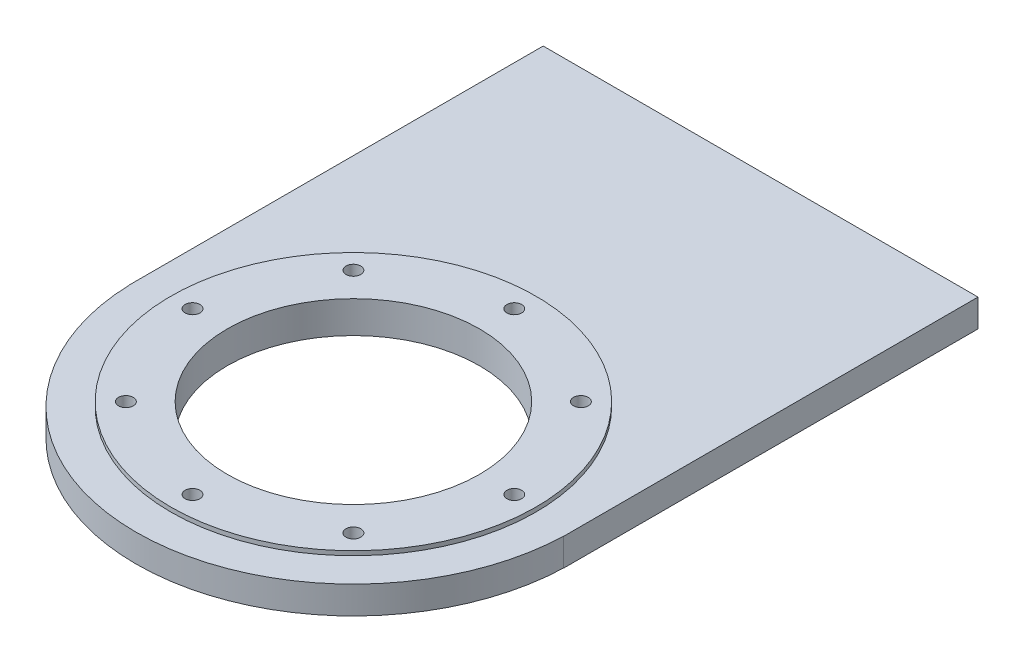
ISO-10303-21;
HEADER;
FILE_DESCRIPTION(('STEP AP214'),'2;1');
FILE_NAME('part.step','',(''),(''),'','','');
FILE_SCHEMA(('AUTOMOTIVE_DESIGN { 1 0 10303 214 1 1 1 1 }'));
ENDSEC;
DATA;
#1=APPLICATION_CONTEXT('core data for automotive mechanical design processes');
#2=APPLICATION_PROTOCOL_DEFINITION('international standard','automotive_design',2000,#1);
#3=PRODUCT_CONTEXT('',#1,'mechanical');
#4=PRODUCT('Part','Part','',(#3));
#5=PRODUCT_RELATED_PRODUCT_CATEGORY('part','',(#4));
#6=PRODUCT_DEFINITION_FORMATION('','',#4);
#7=PRODUCT_DEFINITION_CONTEXT('part definition',#1,'design');
#8=PRODUCT_DEFINITION('design','',#6,#7);
#9=PRODUCT_DEFINITION_SHAPE('','',#8);
#10=(LENGTH_UNIT() NAMED_UNIT(*) SI_UNIT(.MILLI.,.METRE.));
#11=(NAMED_UNIT(*) PLANE_ANGLE_UNIT() SI_UNIT($,.RADIAN.));
#12=(NAMED_UNIT(*) SI_UNIT($,.STERADIAN.) SOLID_ANGLE_UNIT());
#13=UNCERTAINTY_MEASURE_WITH_UNIT(LENGTH_MEASURE(1.E-05),#10,'distance_accuracy_value','');
#14=(GEOMETRIC_REPRESENTATION_CONTEXT(3) GLOBAL_UNCERTAINTY_ASSIGNED_CONTEXT((#13)) GLOBAL_UNIT_ASSIGNED_CONTEXT((#10,
#11,#12)) REPRESENTATION_CONTEXT('',''));
#15=CARTESIAN_POINT('',(0.,0.,0.));
#16=DIRECTION('',(0.,0.,1.));
#17=DIRECTION('',(1.,0.,0.));
#18=AXIS2_PLACEMENT_3D('',#15,#16,#17);
#19=CARTESIAN_POINT('',(-50.,-29.75,171.65));
#20=DIRECTION('',(0.,0.,-1.));
#21=DIRECTION('',(-1.,0.,0.));
#22=AXIS2_PLACEMENT_3D('',#19,#20,#21);
#23=PLANE('',#22);
#24=DIRECTION('',(0.,-1.,0.));
#25=VECTOR('',#24,1.);
#26=CARTESIAN_POINT('',(49.9727675839552,-29.75,171.65));
#27=LINE('',#26,#25);
#28=CARTESIAN_POINT('',(49.9727675839552,-36.1,171.65));
#29=VERTEX_POINT('',#28);
#30=CARTESIAN_POINT('',(49.9727675839552,-29.75,171.65));
#31=VERTEX_POINT('',#30);
#32=EDGE_CURVE('E120',#29,#31,#27,.F.);
#33=ORIENTED_EDGE('',*,*,#32,.F.);
#34=DIRECTION('',(1.,0.,0.));
#35=VECTOR('',#34,1.);
#36=CARTESIAN_POINT('',(-50.,-36.1,171.65));
#37=LINE('',#36,#35);
#38=CARTESIAN_POINT('',(50.,-36.1,171.65));
#39=VERTEX_POINT('',#38);
#40=EDGE_CURVE('E110',#29,#39,#37,.T.);
#41=ORIENTED_EDGE('',*,*,#40,.T.);
#42=DIRECTION('',(0.,-1.,0.));
#43=VECTOR('',#42,1.);
#44=CARTESIAN_POINT('',(50.,-29.75,171.65));
#45=LINE('',#44,#43);
#46=CARTESIAN_POINT('',(50.,-29.75,171.65));
#47=VERTEX_POINT('',#46);
#48=EDGE_CURVE('E147',#47,#39,#45,.T.);
#49=ORIENTED_EDGE('',*,*,#48,.F.);
#50=DIRECTION('',(1.,0.,0.));
#51=VECTOR('',#50,1.);
#52=CARTESIAN_POINT('',(-50.,-29.75,171.65));
#53=LINE('',#52,#51);
#54=EDGE_CURVE('E58',#31,#47,#53,.T.);
#55=ORIENTED_EDGE('',*,*,#54,.F.);
#56=EDGE_LOOP('',(#33,#41,#49,#55));
#57=FACE_BOUND('',#56,.T.);
#58=ADVANCED_FACE('F43',(#57),#23,.F.);
#59=DIRECTION('',(0.,-1.,0.));
#60=VECTOR('',#59,1.);
#61=CARTESIAN_POINT('',(-49.9727675839552,-29.75,171.65));
#62=LINE('',#61,#60);
#63=CARTESIAN_POINT('',(-49.9727675839552,-29.75,171.65));
#64=VERTEX_POINT('',#63);
#65=CARTESIAN_POINT('',(-49.9727675839552,-36.1,171.65));
#66=VERTEX_POINT('',#65);
#67=EDGE_CURVE('E66',#64,#66,#62,.T.);
#68=ORIENTED_EDGE('',*,*,#67,.F.);
#69=CARTESIAN_POINT('',(-50.,-29.75,171.65));
#70=VERTEX_POINT('',#69);
#71=EDGE_CURVE('E143',#70,#64,#53,.T.);
#72=ORIENTED_EDGE('',*,*,#71,.F.);
#73=DIRECTION('',(0.,-1.,0.));
#74=VECTOR('',#73,1.);
#75=CARTESIAN_POINT('',(-50.,-29.75,171.65));
#76=LINE('',#75,#74);
#77=CARTESIAN_POINT('',(-50.,-36.1,171.65));
#78=VERTEX_POINT('',#77);
#79=EDGE_CURVE('E103',#70,#78,#76,.T.);
#80=ORIENTED_EDGE('',*,*,#79,.T.);
#81=EDGE_CURVE('E96',#78,#66,#37,.T.);
#82=ORIENTED_EDGE('',*,*,#81,.T.);
#83=EDGE_LOOP('',(#68,#72,#80,#82));
#84=FACE_BOUND('',#83,.T.);
#85=ADVANCED_FACE('F100',(#84),#23,.F.);
#86=CARTESIAN_POINT('',(50.,-29.75,171.65));
#87=DIRECTION('',(-1.,0.,0.));
#88=DIRECTION('',(0.,0.,1.));
#89=AXIS2_PLACEMENT_3D('',#86,#87,#88);
#90=PLANE('',#89);
#91=DIRECTION('',(0.,0.,-1.));
#92=VECTOR('',#91,1.);
#93=CARTESIAN_POINT('',(50.,-36.1,171.65));
#94=LINE('',#93,#92);
#95=CARTESIAN_POINT('',(50.,-36.1,76.35));
#96=VERTEX_POINT('',#95);
#97=EDGE_CURVE('E137',#39,#96,#94,.T.);
#98=ORIENTED_EDGE('',*,*,#97,.T.);
#99=DIRECTION('',(0.,-1.,0.));
#100=VECTOR('',#99,1.);
#101=CARTESIAN_POINT('',(50.,-29.75,76.35));
#102=LINE('',#101,#100);
#103=CARTESIAN_POINT('',(50.,-29.75,76.35));
#104=VERTEX_POINT('',#103);
#105=EDGE_CURVE('E50',#104,#96,#102,.T.);
#106=ORIENTED_EDGE('',*,*,#105,.F.);
#107=DIRECTION('',(0.,0.,-1.));
#108=VECTOR('',#107,1.);
#109=CARTESIAN_POINT('',(50.,-29.75,171.65));
#110=LINE('',#109,#108);
#111=EDGE_CURVE('E106',#47,#104,#110,.T.);
#112=ORIENTED_EDGE('',*,*,#111,.F.);
#113=ORIENTED_EDGE('',*,*,#48,.T.);
#114=EDGE_LOOP('',(#98,#106,#112,#113));
#115=FACE_BOUND('',#114,.T.);
#116=ADVANCED_FACE('F44',(#115),#90,.F.);
#117=CARTESIAN_POINT('',(-50.,-29.75,76.35));
#118=DIRECTION('',(0.,0.,1.));
#119=DIRECTION('',(1.,0.,0.));
#120=AXIS2_PLACEMENT_3D('',#117,#118,#119);
#121=PLANE('',#120);
#122=CARTESIAN_POINT('',(-42.,-32.9225,76.35));
#123=DIRECTION('',(0.,0.,-1.));
#124=DIRECTION('',(-1.,0.,0.));
#125=AXIS2_PLACEMENT_3D('',#122,#123,#124);
#126=CIRCLE('',#125,1.25);
#127=CARTESIAN_POINT('',(-43.25,-32.9225,76.35));
#128=VERTEX_POINT('',#127);
#129=EDGE_CURVE('E299',#128,#128,#126,.T.);
#130=ORIENTED_EDGE('',*,*,#129,.F.);
#131=EDGE_LOOP('',(#130));
#132=FACE_BOUND('',#131,.T.);
#133=CARTESIAN_POINT('',(-20.,-32.9225,76.35));
#134=DIRECTION('',(0.,0.,-1.));
#135=DIRECTION('',(-1.,0.,0.));
#136=AXIS2_PLACEMENT_3D('',#133,#134,#135);
#137=CIRCLE('',#136,1.25);
#138=CARTESIAN_POINT('',(-21.25,-32.9225,76.35));
#139=VERTEX_POINT('',#138);
#140=EDGE_CURVE('E303',#139,#139,#137,.T.);
#141=ORIENTED_EDGE('',*,*,#140,.F.);
#142=EDGE_LOOP('',(#141));
#143=FACE_BOUND('',#142,.T.);
#144=CARTESIAN_POINT('',(20.,-32.9225,76.35));
#145=DIRECTION('',(0.,0.,-1.));
#146=DIRECTION('',(-1.,0.,0.));
#147=AXIS2_PLACEMENT_3D('',#144,#145,#146);
#148=CIRCLE('',#147,1.25);
#149=CARTESIAN_POINT('',(18.75,-32.9225,76.35));
#150=VERTEX_POINT('',#149);
#151=EDGE_CURVE('E187',#150,#150,#148,.T.);
#152=ORIENTED_EDGE('',*,*,#151,.F.);
#153=EDGE_LOOP('',(#152));
#154=FACE_BOUND('',#153,.T.);
#155=CARTESIAN_POINT('',(42.,-32.9225,76.35));
#156=DIRECTION('',(0.,0.,-1.));
#157=DIRECTION('',(-1.,0.,0.));
#158=AXIS2_PLACEMENT_3D('',#155,#156,#157);
#159=CIRCLE('',#158,1.25);
#160=CARTESIAN_POINT('',(40.75,-32.9225,76.35));
#161=VERTEX_POINT('',#160);
#162=EDGE_CURVE('E188',#161,#161,#159,.T.);
#163=ORIENTED_EDGE('',*,*,#162,.F.);
#164=EDGE_LOOP('',(#163));
#165=FACE_BOUND('',#164,.T.);
#166=DIRECTION('',(-1.,0.,0.));
#167=VECTOR('',#166,1.);
#168=CARTESIAN_POINT('',(-50.,-36.1,76.35));
#169=LINE('',#168,#167);
#170=CARTESIAN_POINT('',(-50.,-36.1,76.35));
#171=VERTEX_POINT('',#170);
#172=EDGE_CURVE('E153',#96,#171,#169,.T.);
#173=ORIENTED_EDGE('',*,*,#172,.T.);
#174=DIRECTION('',(0.,-1.,0.));
#175=VECTOR('',#174,1.);
#176=CARTESIAN_POINT('',(-50.,-29.75,76.35));
#177=LINE('',#176,#175);
#178=CARTESIAN_POINT('',(-50.,-29.75,76.35));
#179=VERTEX_POINT('',#178);
#180=EDGE_CURVE('E163',#179,#171,#177,.T.);
#181=ORIENTED_EDGE('',*,*,#180,.F.);
#182=DIRECTION('',(-1.,0.,0.));
#183=VECTOR('',#182,1.);
#184=CARTESIAN_POINT('',(-50.,-29.75,76.35));
#185=LINE('',#184,#183);
#186=EDGE_CURVE('E139',#104,#179,#185,.T.);
#187=ORIENTED_EDGE('',*,*,#186,.F.);
#188=ORIENTED_EDGE('',*,*,#105,.T.);
#189=EDGE_LOOP('',(#173,#181,#187,#188));
#190=FACE_BOUND('',#189,.T.);
#191=ADVANCED_FACE('F176',(#132,#143,#154,#165,#190),#121,.F.);
#192=CARTESIAN_POINT('',(-50.,-29.75,171.65));
#193=DIRECTION('',(1.,0.,0.));
#194=DIRECTION('',(0.,0.,-1.));
#195=AXIS2_PLACEMENT_3D('',#192,#193,#194);
#196=PLANE('',#195);
#197=DIRECTION('',(0.,0.,1.));
#198=VECTOR('',#197,1.);
#199=CARTESIAN_POINT('',(-50.,-36.1,171.65));
#200=LINE('',#199,#198);
#201=EDGE_CURVE('E154',#171,#78,#200,.T.);
#202=ORIENTED_EDGE('',*,*,#201,.T.);
#203=ORIENTED_EDGE('',*,*,#79,.F.);
#204=DIRECTION('',(0.,0.,1.));
#205=VECTOR('',#204,1.);
#206=CARTESIAN_POINT('',(-50.,-29.75,171.65));
#207=LINE('',#206,#205);
#208=EDGE_CURVE('E145',#179,#70,#207,.T.);
#209=ORIENTED_EDGE('',*,*,#208,.F.);
#210=ORIENTED_EDGE('',*,*,#180,.T.);
#211=EDGE_LOOP('',(#202,#203,#209,#210));
#212=FACE_BOUND('',#211,.T.);
#213=ADVANCED_FACE('F179',(#212),#196,.F.);
#214=CARTESIAN_POINT('',(0.,-29.75,0.));
#215=DIRECTION('',(0.,-1.,0.));
#216=DIRECTION('',(0.,0.,-1.));
#217=AXIS2_PLACEMENT_3D('',#214,#215,#216);
#218=PLANE('',#217);
#219=CARTESIAN_POINT('',(0.,-29.75,170.));
#220=DIRECTION('',(0.,1.,0.));
#221=DIRECTION('',(0.,0.,1.));
#222=AXIS2_PLACEMENT_3D('',#219,#220,#221);
#223=CIRCLE('',#222,42.);
#224=CARTESIAN_POINT('',(0.,-29.75,212.));
#225=VERTEX_POINT('',#224);
#226=EDGE_CURVE('E11',#225,#225,#223,.T.);
#227=ORIENTED_EDGE('',*,*,#226,.F.);
#228=EDGE_LOOP('',(#227));
#229=FACE_BOUND('',#228,.T.);
#230=ORIENTED_EDGE('',*,*,#71,.T.);
#231=CARTESIAN_POINT('',(0.,-29.75,170.));
#232=DIRECTION('',(0.,1.,0.));
#233=DIRECTION('',(0.,0.,1.));
#234=AXIS2_PLACEMENT_3D('',#231,#232,#233);
#235=CIRCLE('',#234,50.);
#236=EDGE_CURVE('E114',#64,#31,#235,.T.);
#237=ORIENTED_EDGE('',*,*,#236,.T.);
#238=ORIENTED_EDGE('',*,*,#54,.T.);
#239=ORIENTED_EDGE('',*,*,#111,.T.);
#240=ORIENTED_EDGE('',*,*,#186,.T.);
#241=ORIENTED_EDGE('',*,*,#208,.T.);
#242=EDGE_LOOP('',(#230,#237,#238,#239,#240,#241));
#243=FACE_BOUND('',#242,.T.);
#244=ADVANCED_FACE('F185',(#229,#243),#218,.F.);
#245=CARTESIAN_POINT('',(0.,-36.1,0.));
#246=DIRECTION('',(0.,-1.,0.));
#247=DIRECTION('',(0.,0.,-1.));
#248=AXIS2_PLACEMENT_3D('',#245,#246,#247);
#249=PLANE('',#248);
#250=CARTESIAN_POINT('',(37.,-36.1,170.));
#251=DIRECTION('',(0.,1.,0.));
#252=DIRECTION('',(0.,0.,1.));
#253=AXIS2_PLACEMENT_3D('',#250,#251,#252);
#254=CIRCLE('',#253,1.7);
#255=CARTESIAN_POINT('',(37.,-36.1,171.7));
#256=VERTEX_POINT('',#255);
#257=EDGE_CURVE('E201',#256,#256,#254,.T.);
#258=ORIENTED_EDGE('',*,*,#257,.T.);
#259=EDGE_LOOP('',(#258));
#260=FACE_BOUND('',#259,.T.);
#261=CARTESIAN_POINT('',(26.1629509039023,-36.1,196.162950903902));
#262=DIRECTION('',(0.,1.,0.));
#263=DIRECTION('',(0.,0.,1.));
#264=AXIS2_PLACEMENT_3D('',#261,#262,#263);
#265=CIRCLE('',#264,1.7);
#266=CARTESIAN_POINT('',(26.1629509039023,-36.1,197.862950903902));
#267=VERTEX_POINT('',#266);
#268=EDGE_CURVE('E209',#267,#267,#265,.T.);
#269=ORIENTED_EDGE('',*,*,#268,.T.);
#270=EDGE_LOOP('',(#269));
#271=FACE_BOUND('',#270,.T.);
#272=CARTESIAN_POINT('',(0.,-36.1,207.));
#273=DIRECTION('',(0.,1.,0.));
#274=DIRECTION('',(0.,0.,1.));
#275=AXIS2_PLACEMENT_3D('',#272,#273,#274);
#276=CIRCLE('',#275,1.7);
#277=CARTESIAN_POINT('',(0.,-36.1,208.7));
#278=VERTEX_POINT('',#277);
#279=EDGE_CURVE('E218',#278,#278,#276,.T.);
#280=ORIENTED_EDGE('',*,*,#279,.T.);
#281=EDGE_LOOP('',(#280));
#282=FACE_BOUND('',#281,.T.);
#283=CARTESIAN_POINT('',(-26.1629509039023,-36.1,196.162950903902));
#284=DIRECTION('',(0.,1.,0.));
#285=DIRECTION('',(0.,0.,1.));
#286=AXIS2_PLACEMENT_3D('',#283,#284,#285);
#287=CIRCLE('',#286,1.7);
#288=CARTESIAN_POINT('',(-26.1629509039023,-36.1,197.862950903902));
#289=VERTEX_POINT('',#288);
#290=EDGE_CURVE('E224',#289,#289,#287,.T.);
#291=ORIENTED_EDGE('',*,*,#290,.T.);
#292=EDGE_LOOP('',(#291));
#293=FACE_BOUND('',#292,.T.);
#294=CARTESIAN_POINT('',(-37.,-36.1,170.));
#295=DIRECTION('',(0.,1.,0.));
#296=DIRECTION('',(0.,0.,1.));
#297=AXIS2_PLACEMENT_3D('',#294,#295,#296);
#298=CIRCLE('',#297,1.7);
#299=CARTESIAN_POINT('',(-37.,-36.1,171.7));
#300=VERTEX_POINT('',#299);
#301=EDGE_CURVE('E233',#300,#300,#298,.T.);
#302=ORIENTED_EDGE('',*,*,#301,.T.);
#303=EDGE_LOOP('',(#302));
#304=FACE_BOUND('',#303,.T.);
#305=CARTESIAN_POINT('',(-26.1629509039023,-36.1,143.837049096098));
#306=DIRECTION('',(0.,1.,0.));
#307=DIRECTION('',(0.,0.,1.));
#308=AXIS2_PLACEMENT_3D('',#305,#306,#307);
#309=CIRCLE('',#308,1.7);
#310=CARTESIAN_POINT('',(-26.1629509039023,-36.1,145.537049096098));
#311=VERTEX_POINT('',#310);
#312=EDGE_CURVE('E237',#311,#311,#309,.T.);
#313=ORIENTED_EDGE('',*,*,#312,.T.);
#314=EDGE_LOOP('',(#313));
#315=FACE_BOUND('',#314,.T.);
#316=CARTESIAN_POINT('',(0.,-36.1,133.));
#317=DIRECTION('',(0.,1.,0.));
#318=DIRECTION('',(0.,0.,1.));
#319=AXIS2_PLACEMENT_3D('',#316,#317,#318);
#320=CIRCLE('',#319,1.7);
#321=CARTESIAN_POINT('',(0.,-36.1,134.7));
#322=VERTEX_POINT('',#321);
#323=EDGE_CURVE('E246',#322,#322,#320,.T.);
#324=ORIENTED_EDGE('',*,*,#323,.T.);
#325=EDGE_LOOP('',(#324));
#326=FACE_BOUND('',#325,.T.);
#327=CARTESIAN_POINT('',(26.1629509039023,-36.1,143.837049096098));
#328=DIRECTION('',(0.,1.,0.));
#329=DIRECTION('',(0.,0.,1.));
#330=AXIS2_PLACEMENT_3D('',#327,#328,#329);
#331=CIRCLE('',#330,1.7);
#332=CARTESIAN_POINT('',(26.1629509039023,-36.1,145.537049096098));
#333=VERTEX_POINT('',#332);
#334=EDGE_CURVE('E254',#333,#333,#331,.T.);
#335=ORIENTED_EDGE('',*,*,#334,.T.);
#336=EDGE_LOOP('',(#335));
#337=FACE_BOUND('',#336,.T.);
#338=CARTESIAN_POINT('',(0.,-36.1,170.));
#339=DIRECTION('',(0.,1.,0.));
#340=DIRECTION('',(0.,0.,1.));
#341=AXIS2_PLACEMENT_3D('',#338,#339,#340);
#342=CIRCLE('',#341,29.);
#343=CARTESIAN_POINT('',(0.,-36.1,199.));
#344=VERTEX_POINT('',#343);
#345=EDGE_CURVE('E204',#344,#344,#342,.T.);
#346=ORIENTED_EDGE('',*,*,#345,.T.);
#347=EDGE_LOOP('',(#346));
#348=FACE_BOUND('',#347,.T.);
#349=ORIENTED_EDGE('',*,*,#81,.F.);
#350=ORIENTED_EDGE('',*,*,#201,.F.);
#351=ORIENTED_EDGE('',*,*,#172,.F.);
#352=ORIENTED_EDGE('',*,*,#97,.F.);
#353=ORIENTED_EDGE('',*,*,#40,.F.);
#354=CARTESIAN_POINT('',(0.,-36.1,170.));
#355=DIRECTION('',(0.,1.,0.));
#356=DIRECTION('',(0.,0.,1.));
#357=AXIS2_PLACEMENT_3D('',#354,#355,#356);
#358=CIRCLE('',#357,50.);
#359=EDGE_CURVE('E113',#66,#29,#358,.T.);
#360=ORIENTED_EDGE('',*,*,#359,.F.);
#361=EDGE_LOOP('',(#349,#350,#351,#352,#353,#360));
#362=FACE_BOUND('',#361,.T.);
#363=ADVANCED_FACE('F119',(#260,#271,#282,#293,#304,#315,#326,#337,#348,#362),#249,.T.);
#364=CARTESIAN_POINT('',(0.,-29.75,170.));
#365=DIRECTION('',(0.,-1.,0.));
#366=DIRECTION('',(0.,0.,-1.));
#367=AXIS2_PLACEMENT_3D('',#364,#365,#366);
#368=CYLINDRICAL_SURFACE('',#367,50.);
#369=ORIENTED_EDGE('',*,*,#359,.T.);
#370=ORIENTED_EDGE('',*,*,#32,.T.);
#371=ORIENTED_EDGE('',*,*,#236,.F.);
#372=ORIENTED_EDGE('',*,*,#67,.T.);
#373=EDGE_LOOP('',(#369,#370,#371,#372));
#374=FACE_BOUND('',#373,.T.);
#375=ADVANCED_FACE('F115',(#374),#368,.T.);
#376=CARTESIAN_POINT('',(0.,-28.75,170.));
#377=DIRECTION('',(0.,1.,0.));
#378=DIRECTION('',(0.,0.,1.));
#379=AXIS2_PLACEMENT_3D('',#376,#377,#378);
#380=PLANE('',#379);
#381=CARTESIAN_POINT('',(37.,-28.75,170.));
#382=DIRECTION('',(0.,1.,0.));
#383=DIRECTION('',(0.,0.,1.));
#384=AXIS2_PLACEMENT_3D('',#381,#382,#383);
#385=CIRCLE('',#384,1.7);
#386=CARTESIAN_POINT('',(37.,-28.75,171.7));
#387=VERTEX_POINT('',#386);
#388=EDGE_CURVE('E197',#387,#387,#385,.T.);
#389=ORIENTED_EDGE('',*,*,#388,.F.);
#390=EDGE_LOOP('',(#389));
#391=FACE_BOUND('',#390,.T.);
#392=CARTESIAN_POINT('',(26.1629509039023,-28.75,196.162950903902));
#393=DIRECTION('',(0.,1.,0.));
#394=DIRECTION('',(0.,0.,1.));
#395=AXIS2_PLACEMENT_3D('',#392,#393,#394);
#396=CIRCLE('',#395,1.7);
#397=CARTESIAN_POINT('',(26.1629509039023,-28.75,197.862950903902));
#398=VERTEX_POINT('',#397);
#399=EDGE_CURVE('E212',#398,#398,#396,.T.);
#400=ORIENTED_EDGE('',*,*,#399,.F.);
#401=EDGE_LOOP('',(#400));
#402=FACE_BOUND('',#401,.T.);
#403=CARTESIAN_POINT('',(0.,-28.75,207.));
#404=DIRECTION('',(0.,1.,0.));
#405=DIRECTION('',(0.,0.,1.));
#406=AXIS2_PLACEMENT_3D('',#403,#404,#405);
#407=CIRCLE('',#406,1.7);
#408=CARTESIAN_POINT('',(0.,-28.75,208.7));
#409=VERTEX_POINT('',#408);
#410=EDGE_CURVE('E217',#409,#409,#407,.T.);
#411=ORIENTED_EDGE('',*,*,#410,.F.);
#412=EDGE_LOOP('',(#411));
#413=FACE_BOUND('',#412,.T.);
#414=CARTESIAN_POINT('',(-26.1629509039023,-28.75,196.162950903902));
#415=DIRECTION('',(0.,1.,0.));
#416=DIRECTION('',(0.,0.,1.));
#417=AXIS2_PLACEMENT_3D('',#414,#415,#416);
#418=CIRCLE('',#417,1.7);
#419=CARTESIAN_POINT('',(-26.1629509039023,-28.75,197.862950903902));
#420=VERTEX_POINT('',#419);
#421=EDGE_CURVE('E226',#420,#420,#418,.T.);
#422=ORIENTED_EDGE('',*,*,#421,.F.);
#423=EDGE_LOOP('',(#422));
#424=FACE_BOUND('',#423,.T.);
#425=CARTESIAN_POINT('',(-37.,-28.75,170.));
#426=DIRECTION('',(0.,1.,0.));
#427=DIRECTION('',(0.,0.,1.));
#428=AXIS2_PLACEMENT_3D('',#425,#426,#427);
#429=CIRCLE('',#428,1.7);
#430=CARTESIAN_POINT('',(-37.,-28.75,171.7));
#431=VERTEX_POINT('',#430);
#432=EDGE_CURVE('E232',#431,#431,#429,.T.);
#433=ORIENTED_EDGE('',*,*,#432,.F.);
#434=EDGE_LOOP('',(#433));
#435=FACE_BOUND('',#434,.T.);
#436=CARTESIAN_POINT('',(-26.1629509039023,-28.75,143.837049096098));
#437=DIRECTION('',(0.,1.,0.));
#438=DIRECTION('',(0.,0.,1.));
#439=AXIS2_PLACEMENT_3D('',#436,#437,#438);
#440=CIRCLE('',#439,1.7);
#441=CARTESIAN_POINT('',(-26.1629509039023,-28.75,145.537049096098));
#442=VERTEX_POINT('',#441);
#443=EDGE_CURVE('E245',#442,#442,#440,.T.);
#444=ORIENTED_EDGE('',*,*,#443,.F.);
#445=EDGE_LOOP('',(#444));
#446=FACE_BOUND('',#445,.T.);
#447=CARTESIAN_POINT('',(0.,-28.75,133.));
#448=DIRECTION('',(0.,1.,0.));
#449=DIRECTION('',(0.,0.,1.));
#450=AXIS2_PLACEMENT_3D('',#447,#448,#449);
#451=CIRCLE('',#450,1.7);
#452=CARTESIAN_POINT('',(0.,-28.75,134.7));
#453=VERTEX_POINT('',#452);
#454=EDGE_CURVE('E249',#453,#453,#451,.T.);
#455=ORIENTED_EDGE('',*,*,#454,.F.);
#456=EDGE_LOOP('',(#455));
#457=FACE_BOUND('',#456,.T.);
#458=CARTESIAN_POINT('',(26.1629509039023,-28.75,143.837049096098));
#459=DIRECTION('',(0.,1.,0.));
#460=DIRECTION('',(0.,0.,1.));
#461=AXIS2_PLACEMENT_3D('',#458,#459,#460);
#462=CIRCLE('',#461,1.7);
#463=CARTESIAN_POINT('',(26.1629509039023,-28.75,145.537049096098));
#464=VERTEX_POINT('',#463);
#465=EDGE_CURVE('E259',#464,#464,#462,.T.);
#466=ORIENTED_EDGE('',*,*,#465,.F.);
#467=EDGE_LOOP('',(#466));
#468=FACE_BOUND('',#467,.T.);
#469=CARTESIAN_POINT('',(0.,-28.75,170.));
#470=DIRECTION('',(0.,1.,0.));
#471=DIRECTION('',(0.,0.,1.));
#472=AXIS2_PLACEMENT_3D('',#469,#470,#471);
#473=CIRCLE('',#472,42.);
#474=CARTESIAN_POINT('',(0.,-28.75,212.));
#475=VERTEX_POINT('',#474);
#476=EDGE_CURVE('E124',#475,#475,#473,.T.);
#477=ORIENTED_EDGE('',*,*,#476,.T.);
#478=EDGE_LOOP('',(#477));
#479=FACE_BOUND('',#478,.T.);
#480=CARTESIAN_POINT('',(0.,-28.75,170.));
#481=DIRECTION('',(0.,1.,0.));
#482=DIRECTION('',(0.,0.,1.));
#483=AXIS2_PLACEMENT_3D('',#480,#481,#482);
#484=CIRCLE('',#483,29.);
#485=CARTESIAN_POINT('',(0.,-28.75,199.));
#486=VERTEX_POINT('',#485);
#487=EDGE_CURVE('E133',#486,#486,#484,.T.);
#488=ORIENTED_EDGE('',*,*,#487,.F.);
#489=EDGE_LOOP('',(#488));
#490=FACE_BOUND('',#489,.T.);
#491=ADVANCED_FACE('F266',(#391,#402,#413,#424,#435,#446,#457,#468,#479,#490),#380,.T.);
#492=CARTESIAN_POINT('',(0.,-28.75,170.));
#493=DIRECTION('',(0.,-1.,0.));
#494=DIRECTION('',(0.,0.,-1.));
#495=AXIS2_PLACEMENT_3D('',#492,#493,#494);
#496=CYLINDRICAL_SURFACE('',#495,42.);
#497=ORIENTED_EDGE('',*,*,#476,.F.);
#498=EDGE_LOOP('',(#497));
#499=FACE_BOUND('',#498,.T.);
#500=ORIENTED_EDGE('',*,*,#226,.T.);
#501=EDGE_LOOP('',(#500));
#502=FACE_BOUND('',#501,.T.);
#503=ADVANCED_FACE('F275',(#499,#502),#496,.T.);
#504=CARTESIAN_POINT('',(0.,-28.75,170.));
#505=DIRECTION('',(0.,-1.,0.));
#506=DIRECTION('',(0.,0.,-1.));
#507=AXIS2_PLACEMENT_3D('',#504,#505,#506);
#508=CYLINDRICAL_SURFACE('',#507,29.);
#509=ORIENTED_EDGE('',*,*,#487,.T.);
#510=EDGE_LOOP('',(#509));
#511=FACE_BOUND('',#510,.T.);
#512=ORIENTED_EDGE('',*,*,#345,.F.);
#513=EDGE_LOOP('',(#512));
#514=FACE_BOUND('',#513,.T.);
#515=ADVANCED_FACE('F270',(#511,#514),#508,.F.);
#516=CARTESIAN_POINT('',(26.1629509039023,-28.75,143.837049096098));
#517=DIRECTION('',(0.,-1.,0.));
#518=DIRECTION('',(0.,0.,-1.));
#519=AXIS2_PLACEMENT_3D('',#516,#517,#518);
#520=CYLINDRICAL_SURFACE('',#519,1.7);
#521=ORIENTED_EDGE('',*,*,#465,.T.);
#522=EDGE_LOOP('',(#521));
#523=FACE_BOUND('',#522,.T.);
#524=ORIENTED_EDGE('',*,*,#334,.F.);
#525=EDGE_LOOP('',(#524));
#526=FACE_BOUND('',#525,.T.);
#527=ADVANCED_FACE('F349',(#523,#526),#520,.F.);
#528=CARTESIAN_POINT('',(0.,-28.75,133.));
#529=DIRECTION('',(0.,-1.,0.));
#530=DIRECTION('',(0.,0.,-1.));
#531=AXIS2_PLACEMENT_3D('',#528,#529,#530);
#532=CYLINDRICAL_SURFACE('',#531,1.7);
#533=ORIENTED_EDGE('',*,*,#454,.T.);
#534=EDGE_LOOP('',(#533));
#535=FACE_BOUND('',#534,.T.);
#536=ORIENTED_EDGE('',*,*,#323,.F.);
#537=EDGE_LOOP('',(#536));
#538=FACE_BOUND('',#537,.T.);
#539=ADVANCED_FACE('F341',(#535,#538),#532,.F.);
#540=CARTESIAN_POINT('',(-26.1629509039023,-28.75,143.837049096098));
#541=DIRECTION('',(0.,-1.,0.));
#542=DIRECTION('',(0.,0.,-1.));
#543=AXIS2_PLACEMENT_3D('',#540,#541,#542);
#544=CYLINDRICAL_SURFACE('',#543,1.7);
#545=ORIENTED_EDGE('',*,*,#443,.T.);
#546=EDGE_LOOP('',(#545));
#547=FACE_BOUND('',#546,.T.);
#548=ORIENTED_EDGE('',*,*,#312,.F.);
#549=EDGE_LOOP('',(#548));
#550=FACE_BOUND('',#549,.T.);
#551=ADVANCED_FACE('F343',(#547,#550),#544,.F.);
#552=CARTESIAN_POINT('',(-37.,-28.75,170.));
#553=DIRECTION('',(0.,-1.,0.));
#554=DIRECTION('',(0.,0.,-1.));
#555=AXIS2_PLACEMENT_3D('',#552,#553,#554);
#556=CYLINDRICAL_SURFACE('',#555,1.7);
#557=ORIENTED_EDGE('',*,*,#432,.T.);
#558=EDGE_LOOP('',(#557));
#559=FACE_BOUND('',#558,.T.);
#560=ORIENTED_EDGE('',*,*,#301,.F.);
#561=EDGE_LOOP('',(#560));
#562=FACE_BOUND('',#561,.T.);
#563=ADVANCED_FACE('F340',(#559,#562),#556,.F.);
#564=CARTESIAN_POINT('',(-26.1629509039023,-28.75,196.162950903902));
#565=DIRECTION('',(0.,-1.,0.));
#566=DIRECTION('',(0.,0.,-1.));
#567=AXIS2_PLACEMENT_3D('',#564,#565,#566);
#568=CYLINDRICAL_SURFACE('',#567,1.7);
#569=ORIENTED_EDGE('',*,*,#421,.T.);
#570=EDGE_LOOP('',(#569));
#571=FACE_BOUND('',#570,.T.);
#572=ORIENTED_EDGE('',*,*,#290,.F.);
#573=EDGE_LOOP('',(#572));
#574=FACE_BOUND('',#573,.T.);
#575=ADVANCED_FACE('F333',(#571,#574),#568,.F.);
#576=CARTESIAN_POINT('',(0.,-28.75,207.));
#577=DIRECTION('',(0.,-1.,0.));
#578=DIRECTION('',(0.,0.,-1.));
#579=AXIS2_PLACEMENT_3D('',#576,#577,#578);
#580=CYLINDRICAL_SURFACE('',#579,1.7);
#581=ORIENTED_EDGE('',*,*,#410,.T.);
#582=EDGE_LOOP('',(#581));
#583=FACE_BOUND('',#582,.T.);
#584=ORIENTED_EDGE('',*,*,#279,.F.);
#585=EDGE_LOOP('',(#584));
#586=FACE_BOUND('',#585,.T.);
#587=ADVANCED_FACE('F329',(#583,#586),#580,.F.);
#588=CARTESIAN_POINT('',(26.1629509039023,-28.75,196.162950903902));
#589=DIRECTION('',(0.,-1.,0.));
#590=DIRECTION('',(0.,0.,-1.));
#591=AXIS2_PLACEMENT_3D('',#588,#589,#590);
#592=CYLINDRICAL_SURFACE('',#591,1.7);
#593=ORIENTED_EDGE('',*,*,#399,.T.);
#594=EDGE_LOOP('',(#593));
#595=FACE_BOUND('',#594,.T.);
#596=ORIENTED_EDGE('',*,*,#268,.F.);
#597=EDGE_LOOP('',(#596));
#598=FACE_BOUND('',#597,.T.);
#599=ADVANCED_FACE('F318',(#595,#598),#592,.F.);
#600=CARTESIAN_POINT('',(37.,-28.75,170.));
#601=DIRECTION('',(0.,-1.,0.));
#602=DIRECTION('',(0.,0.,-1.));
#603=AXIS2_PLACEMENT_3D('',#600,#601,#602);
#604=CYLINDRICAL_SURFACE('',#603,1.7);
#605=ORIENTED_EDGE('',*,*,#388,.T.);
#606=EDGE_LOOP('',(#605));
#607=FACE_BOUND('',#606,.T.);
#608=ORIENTED_EDGE('',*,*,#257,.F.);
#609=EDGE_LOOP('',(#608));
#610=FACE_BOUND('',#609,.T.);
#611=ADVANCED_FACE('F315',(#607,#610),#604,.F.);
#612=CARTESIAN_POINT('',(42.,-32.9225,85.35));
#613=DIRECTION('',(0.,0.,-1.));
#614=DIRECTION('',(-1.,0.,0.));
#615=AXIS2_PLACEMENT_3D('',#612,#613,#614);
#616=CYLINDRICAL_SURFACE('',#615,1.25);
#617=CARTESIAN_POINT('',(42.,-32.9225,85.35));
#618=DIRECTION('',(0.,0.,-1.));
#619=DIRECTION('',(-1.,0.,0.));
#620=AXIS2_PLACEMENT_3D('',#617,#618,#619);
#621=CIRCLE('',#620,1.25);
#622=CARTESIAN_POINT('',(40.75,-32.9225,85.35));
#623=VERTEX_POINT('',#622);
#624=EDGE_CURVE('E189',#623,#623,#621,.T.);
#625=ORIENTED_EDGE('',*,*,#624,.F.);
#626=EDGE_LOOP('',(#625));
#627=FACE_BOUND('',#626,.T.);
#628=ORIENTED_EDGE('',*,*,#162,.T.);
#629=EDGE_LOOP('',(#628));
#630=FACE_BOUND('',#629,.T.);
#631=ADVANCED_FACE('F307',(#627,#630),#616,.F.);
#632=CARTESIAN_POINT('',(42.,-32.9225,85.35));
#633=DIRECTION('',(0.,0.,-1.));
#634=DIRECTION('',(-1.,0.,0.));
#635=AXIS2_PLACEMENT_3D('',#632,#633,#634);
#636=PLANE('',#635);
#637=ORIENTED_EDGE('',*,*,#624,.T.);
#638=EDGE_LOOP('',(#637));
#639=FACE_BOUND('',#638,.T.);
#640=ADVANCED_FACE('F311',(#639),#636,.T.);
#641=CARTESIAN_POINT('',(20.,-32.9225,85.35));
#642=DIRECTION('',(0.,0.,-1.));
#643=DIRECTION('',(-1.,0.,0.));
#644=AXIS2_PLACEMENT_3D('',#641,#642,#643);
#645=CYLINDRICAL_SURFACE('',#644,1.25);
#646=CARTESIAN_POINT('',(20.,-32.9225,85.35));
#647=DIRECTION('',(0.,0.,-1.));
#648=DIRECTION('',(-1.,0.,0.));
#649=AXIS2_PLACEMENT_3D('',#646,#647,#648);
#650=CIRCLE('',#649,1.25);
#651=CARTESIAN_POINT('',(18.75,-32.9225,85.35));
#652=VERTEX_POINT('',#651);
#653=EDGE_CURVE('E198',#652,#652,#650,.T.);
#654=ORIENTED_EDGE('',*,*,#653,.F.);
#655=EDGE_LOOP('',(#654));
#656=FACE_BOUND('',#655,.T.);
#657=ORIENTED_EDGE('',*,*,#151,.T.);
#658=EDGE_LOOP('',(#657));
#659=FACE_BOUND('',#658,.T.);
#660=ADVANCED_FACE('F319',(#656,#659),#645,.F.);
#661=CARTESIAN_POINT('',(20.,-32.9225,85.35));
#662=DIRECTION('',(0.,0.,-1.));
#663=DIRECTION('',(-1.,0.,0.));
#664=AXIS2_PLACEMENT_3D('',#661,#662,#663);
#665=PLANE('',#664);
#666=ORIENTED_EDGE('',*,*,#653,.T.);
#667=EDGE_LOOP('',(#666));
#668=FACE_BOUND('',#667,.T.);
#669=ADVANCED_FACE('F325',(#668),#665,.T.);
#670=CARTESIAN_POINT('',(-20.,-32.9225,85.35));
#671=DIRECTION('',(0.,0.,-1.));
#672=DIRECTION('',(-1.,0.,0.));
#673=AXIS2_PLACEMENT_3D('',#670,#671,#672);
#674=CYLINDRICAL_SURFACE('',#673,1.25);
#675=CARTESIAN_POINT('',(-20.,-32.9225,85.35));
#676=DIRECTION('',(0.,0.,-1.));
#677=DIRECTION('',(-1.,0.,0.));
#678=AXIS2_PLACEMENT_3D('',#675,#676,#677);
#679=CIRCLE('',#678,1.25);
#680=CARTESIAN_POINT('',(-21.25,-32.9225,85.35));
#681=VERTEX_POINT('',#680);
#682=EDGE_CURVE('E606',#681,#681,#679,.T.);
#683=ORIENTED_EDGE('',*,*,#682,.F.);
#684=EDGE_LOOP('',(#683));
#685=FACE_BOUND('',#684,.T.);
#686=ORIENTED_EDGE('',*,*,#140,.T.);
#687=EDGE_LOOP('',(#686));
#688=FACE_BOUND('',#687,.T.);
#689=ADVANCED_FACE('F420',(#685,#688),#674,.F.);
#690=CARTESIAN_POINT('',(-20.,-32.9225,85.35));
#691=DIRECTION('',(0.,0.,-1.));
#692=DIRECTION('',(-1.,0.,0.));
#693=AXIS2_PLACEMENT_3D('',#690,#691,#692);
#694=PLANE('',#693);
#695=ORIENTED_EDGE('',*,*,#682,.T.);
#696=EDGE_LOOP('',(#695));
#697=FACE_BOUND('',#696,.T.);
#698=ADVANCED_FACE('F428',(#697),#694,.T.);
#699=CARTESIAN_POINT('',(-42.,-32.9225,85.35));
#700=DIRECTION('',(0.,0.,-1.));
#701=DIRECTION('',(-1.,0.,0.));
#702=AXIS2_PLACEMENT_3D('',#699,#700,#701);
#703=CYLINDRICAL_SURFACE('',#702,1.25);
#704=CARTESIAN_POINT('',(-42.,-32.9225,85.35));
#705=DIRECTION('',(0.,0.,-1.));
#706=DIRECTION('',(-1.,0.,0.));
#707=AXIS2_PLACEMENT_3D('',#704,#705,#706);
#708=CIRCLE('',#707,1.25);
#709=CARTESIAN_POINT('',(-43.25,-32.9225,85.35));
#710=VERTEX_POINT('',#709);
#711=EDGE_CURVE('E263',#710,#710,#708,.T.);
#712=ORIENTED_EDGE('',*,*,#711,.F.);
#713=EDGE_LOOP('',(#712));
#714=FACE_BOUND('',#713,.T.);
#715=ORIENTED_EDGE('',*,*,#129,.T.);
#716=EDGE_LOOP('',(#715));
#717=FACE_BOUND('',#716,.T.);
#718=ADVANCED_FACE('F436',(#714,#717),#703,.F.);
#719=CARTESIAN_POINT('',(-42.,-32.9225,85.35));
#720=DIRECTION('',(0.,0.,-1.));
#721=DIRECTION('',(-1.,0.,0.));
#722=AXIS2_PLACEMENT_3D('',#719,#720,#721);
#723=PLANE('',#722);
#724=ORIENTED_EDGE('',*,*,#711,.T.);
#725=EDGE_LOOP('',(#724));
#726=FACE_BOUND('',#725,.T.);
#727=ADVANCED_FACE('F447',(#726),#723,.T.);
#728=CLOSED_SHELL('',(#58,#85,#116,#191,#213,#244,#363,#375,#491,#503,#515,#527,#539,#551,#563,
#575,#587,#599,#611,#631,#640,#660,#669,#689,#698,#718,#727));
#729=MANIFOLD_SOLID_BREP('B2',#728);
#730=ADVANCED_BREP_SHAPE_REPRESENTATION('',(#18,#729),#14);
#731=SHAPE_DEFINITION_REPRESENTATION(#9,#730);
ENDSEC;
END-ISO-10303-21;
